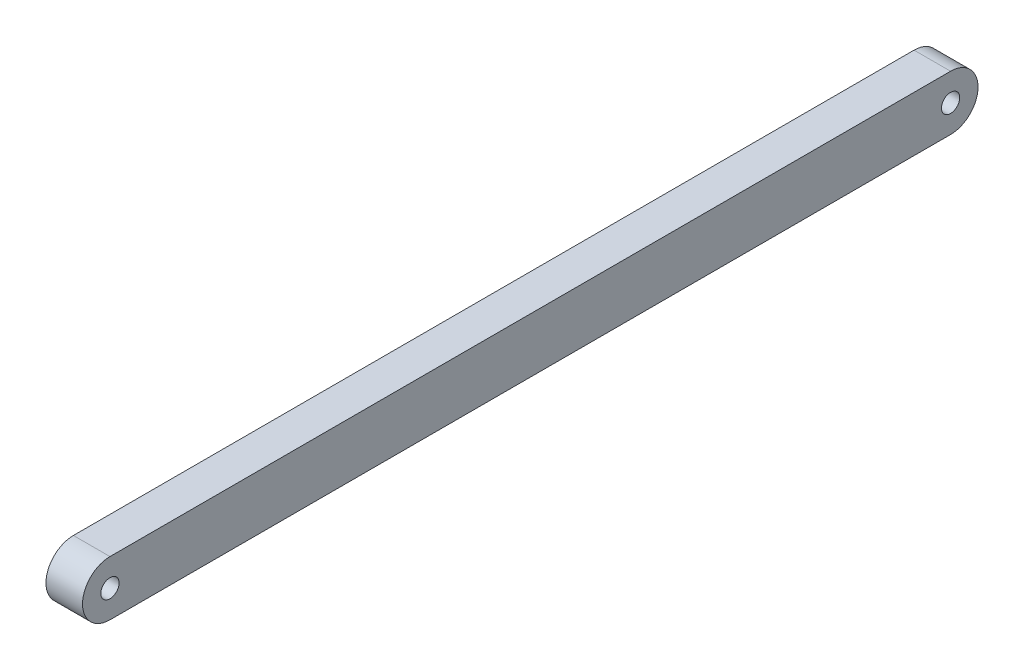
ISO-10303-21;
HEADER;
FILE_DESCRIPTION(('STEP AP214'),'2;1');
FILE_NAME('part.step','',(''),(''),'','','');
FILE_SCHEMA(('AUTOMOTIVE_DESIGN { 1 0 10303 214 1 1 1 1 }'));
ENDSEC;
DATA;
#1=APPLICATION_CONTEXT('core data for automotive mechanical design processes');
#2=APPLICATION_PROTOCOL_DEFINITION('international standard','automotive_design',2000,#1);
#3=PRODUCT_CONTEXT('',#1,'mechanical');
#4=PRODUCT('Part','Part','',(#3));
#5=PRODUCT_RELATED_PRODUCT_CATEGORY('part','',(#4));
#6=PRODUCT_DEFINITION_FORMATION('','',#4);
#7=PRODUCT_DEFINITION_CONTEXT('part definition',#1,'design');
#8=PRODUCT_DEFINITION('design','',#6,#7);
#9=PRODUCT_DEFINITION_SHAPE('','',#8);
#10=(LENGTH_UNIT() NAMED_UNIT(*) SI_UNIT(.MILLI.,.METRE.));
#11=(NAMED_UNIT(*) PLANE_ANGLE_UNIT() SI_UNIT($,.RADIAN.));
#12=(NAMED_UNIT(*) SI_UNIT($,.STERADIAN.) SOLID_ANGLE_UNIT());
#13=UNCERTAINTY_MEASURE_WITH_UNIT(LENGTH_MEASURE(1.E-05),#10,'distance_accuracy_value','');
#14=(GEOMETRIC_REPRESENTATION_CONTEXT(3) GLOBAL_UNCERTAINTY_ASSIGNED_CONTEXT((#13)) GLOBAL_UNIT_ASSIGNED_CONTEXT((#10,
#11,#12)) REPRESENTATION_CONTEXT('',''));
#15=CARTESIAN_POINT('',(0.,0.,0.));
#16=DIRECTION('',(0.,0.,1.));
#17=DIRECTION('',(1.,0.,0.));
#18=AXIS2_PLACEMENT_3D('',#15,#16,#17);
#19=CARTESIAN_POINT('',(2.,0.,0.));
#20=DIRECTION('',(1.,0.,0.));
#21=DIRECTION('',(0.,0.,-1.));
#22=AXIS2_PLACEMENT_3D('',#19,#20,#21);
#23=PLANE('',#22);
#24=CARTESIAN_POINT('',(2.,0.,0.));
#25=DIRECTION('',(1.,0.,0.));
#26=DIRECTION('',(0.,0.,-1.));
#27=AXIS2_PLACEMENT_3D('',#24,#25,#26);
#28=CIRCLE('',#27,0.5);
#29=CARTESIAN_POINT('',(2.,0.,-0.5));
#30=VERTEX_POINT('',#29);
#31=EDGE_CURVE('E108',#30,#30,#28,.T.);
#32=ORIENTED_EDGE('',*,*,#31,.F.);
#33=EDGE_LOOP('',(#32));
#34=FACE_BOUND('',#33,.T.);
#35=CARTESIAN_POINT('',(2.,0.,0.));
#36=DIRECTION('',(1.,0.,0.));
#37=DIRECTION('',(0.,0.,-1.));
#38=AXIS2_PLACEMENT_3D('',#35,#36,#37);
#39=CIRCLE('',#38,1.5);
#40=CARTESIAN_POINT('',(2.,1.5,0.));
#41=VERTEX_POINT('',#40);
#42=CARTESIAN_POINT('',(2.,-1.5,0.));
#43=VERTEX_POINT('',#42);
#44=EDGE_CURVE('E93',#41,#43,#39,.T.);
#45=ORIENTED_EDGE('',*,*,#44,.T.);
#46=DIRECTION('',(0.,0.,-1.));
#47=VECTOR('',#46,1.);
#48=CARTESIAN_POINT('',(2.,-1.5,0.));
#49=LINE('',#48,#47);
#50=CARTESIAN_POINT('',(2.,-1.5,-46.));
#51=VERTEX_POINT('',#50);
#52=EDGE_CURVE('E88',#43,#51,#49,.T.);
#53=ORIENTED_EDGE('',*,*,#52,.T.);
#54=CARTESIAN_POINT('',(2.,0.,-46.));
#55=DIRECTION('',(1.,0.,0.));
#56=DIRECTION('',(0.,0.,-1.));
#57=AXIS2_PLACEMENT_3D('',#54,#55,#56);
#58=CIRCLE('',#57,1.5);
#59=CARTESIAN_POINT('',(2.,1.5,-46.));
#60=VERTEX_POINT('',#59);
#61=EDGE_CURVE('E91',#51,#60,#58,.T.);
#62=ORIENTED_EDGE('',*,*,#61,.T.);
#63=DIRECTION('',(0.,0.,1.));
#64=VECTOR('',#63,1.);
#65=CARTESIAN_POINT('',(2.,1.5,0.));
#66=LINE('',#65,#64);
#67=EDGE_CURVE('E58',#60,#41,#66,.T.);
#68=ORIENTED_EDGE('',*,*,#67,.T.);
#69=EDGE_LOOP('',(#45,#53,#62,#68));
#70=FACE_BOUND('',#69,.T.);
#71=CARTESIAN_POINT('',(2.,0.,-46.));
#72=DIRECTION('',(1.,0.,0.));
#73=DIRECTION('',(0.,0.,-1.));
#74=AXIS2_PLACEMENT_3D('',#71,#72,#73);
#75=CIRCLE('',#74,0.499999999999999);
#76=CARTESIAN_POINT('',(2.,0.,-46.5));
#77=VERTEX_POINT('',#76);
#78=EDGE_CURVE('E123',#77,#77,#75,.T.);
#79=ORIENTED_EDGE('',*,*,#78,.F.);
#80=EDGE_LOOP('',(#79));
#81=FACE_BOUND('',#80,.T.);
#82=ADVANCED_FACE('F41',(#34,#70,#81),#23,.T.);
#83=CARTESIAN_POINT('',(0.,0.,0.));
#84=DIRECTION('',(1.,0.,0.));
#85=DIRECTION('',(0.,0.,-1.));
#86=AXIS2_PLACEMENT_3D('',#83,#84,#85);
#87=PLANE('',#86);
#88=CARTESIAN_POINT('',(0.,0.,0.));
#89=DIRECTION('',(1.,0.,0.));
#90=DIRECTION('',(0.,0.,-1.));
#91=AXIS2_PLACEMENT_3D('',#88,#89,#90);
#92=CIRCLE('',#91,1.5);
#93=CARTESIAN_POINT('',(0.,1.5,0.));
#94=VERTEX_POINT('',#93);
#95=CARTESIAN_POINT('',(0.,-1.5,0.));
#96=VERTEX_POINT('',#95);
#97=EDGE_CURVE('E105',#94,#96,#92,.T.);
#98=ORIENTED_EDGE('',*,*,#97,.F.);
#99=DIRECTION('',(0.,0.,1.));
#100=VECTOR('',#99,1.);
#101=CARTESIAN_POINT('',(0.,1.5,0.));
#102=LINE('',#101,#100);
#103=CARTESIAN_POINT('',(0.,1.5,-46.));
#104=VERTEX_POINT('',#103);
#105=EDGE_CURVE('E81',#104,#94,#102,.T.);
#106=ORIENTED_EDGE('',*,*,#105,.F.);
#107=CARTESIAN_POINT('',(0.,0.,-46.));
#108=DIRECTION('',(1.,0.,0.));
#109=DIRECTION('',(0.,0.,-1.));
#110=AXIS2_PLACEMENT_3D('',#107,#108,#109);
#111=CIRCLE('',#110,1.5);
#112=CARTESIAN_POINT('',(0.,-1.5,-46.));
#113=VERTEX_POINT('',#112);
#114=EDGE_CURVE('E75',#113,#104,#111,.T.);
#115=ORIENTED_EDGE('',*,*,#114,.F.);
#116=DIRECTION('',(0.,0.,-1.));
#117=VECTOR('',#116,1.);
#118=CARTESIAN_POINT('',(0.,-1.5,0.));
#119=LINE('',#118,#117);
#120=EDGE_CURVE('E97',#96,#113,#119,.T.);
#121=ORIENTED_EDGE('',*,*,#120,.F.);
#122=EDGE_LOOP('',(#98,#106,#115,#121));
#123=FACE_BOUND('',#122,.T.);
#124=CARTESIAN_POINT('',(0.,0.,0.));
#125=DIRECTION('',(1.,0.,0.));
#126=DIRECTION('',(0.,0.,-1.));
#127=AXIS2_PLACEMENT_3D('',#124,#125,#126);
#128=CIRCLE('',#127,0.5);
#129=CARTESIAN_POINT('',(0.,0.,-0.5));
#130=VERTEX_POINT('',#129);
#131=EDGE_CURVE('E120',#130,#130,#128,.T.);
#132=ORIENTED_EDGE('',*,*,#131,.T.);
#133=EDGE_LOOP('',(#132));
#134=FACE_BOUND('',#133,.T.);
#135=CARTESIAN_POINT('',(0.,0.,-46.));
#136=DIRECTION('',(1.,0.,0.));
#137=DIRECTION('',(0.,0.,-1.));
#138=AXIS2_PLACEMENT_3D('',#135,#136,#137);
#139=CIRCLE('',#138,0.499999999999999);
#140=CARTESIAN_POINT('',(0.,0.,-46.5));
#141=VERTEX_POINT('',#140);
#142=EDGE_CURVE('E126',#141,#141,#139,.T.);
#143=ORIENTED_EDGE('',*,*,#142,.T.);
#144=EDGE_LOOP('',(#143));
#145=FACE_BOUND('',#144,.T.);
#146=ADVANCED_FACE('F116',(#123,#134,#145),#87,.F.);
#147=CARTESIAN_POINT('',(2.,0.,0.));
#148=DIRECTION('',(-1.,0.,0.));
#149=DIRECTION('',(0.,0.,1.));
#150=AXIS2_PLACEMENT_3D('',#147,#148,#149);
#151=CYLINDRICAL_SURFACE('',#150,1.5);
#152=ORIENTED_EDGE('',*,*,#97,.T.);
#153=DIRECTION('',(-1.,0.,0.));
#154=VECTOR('',#153,1.);
#155=CARTESIAN_POINT('',(2.,-1.5,0.));
#156=LINE('',#155,#154);
#157=EDGE_CURVE('E11',#43,#96,#156,.T.);
#158=ORIENTED_EDGE('',*,*,#157,.F.);
#159=ORIENTED_EDGE('',*,*,#44,.F.);
#160=DIRECTION('',(-1.,0.,0.));
#161=VECTOR('',#160,1.);
#162=CARTESIAN_POINT('',(2.,1.5,0.));
#163=LINE('',#162,#161);
#164=EDGE_CURVE('E101',#41,#94,#163,.T.);
#165=ORIENTED_EDGE('',*,*,#164,.T.);
#166=EDGE_LOOP('',(#152,#158,#159,#165));
#167=FACE_BOUND('',#166,.T.);
#168=ADVANCED_FACE('F43',(#167),#151,.T.);
#169=CARTESIAN_POINT('',(2.,-1.5,0.));
#170=DIRECTION('',(0.,1.,0.));
#171=DIRECTION('',(0.,0.,1.));
#172=AXIS2_PLACEMENT_3D('',#169,#170,#171);
#173=PLANE('',#172);
#174=ORIENTED_EDGE('',*,*,#120,.T.);
#175=DIRECTION('',(-1.,0.,0.));
#176=VECTOR('',#175,1.);
#177=CARTESIAN_POINT('',(2.,-1.5,-46.));
#178=LINE('',#177,#176);
#179=EDGE_CURVE('E50',#51,#113,#178,.T.);
#180=ORIENTED_EDGE('',*,*,#179,.F.);
#181=ORIENTED_EDGE('',*,*,#52,.F.);
#182=ORIENTED_EDGE('',*,*,#157,.T.);
#183=EDGE_LOOP('',(#174,#180,#181,#182));
#184=FACE_BOUND('',#183,.T.);
#185=ADVANCED_FACE('F96',(#184),#173,.F.);
#186=CARTESIAN_POINT('',(2.,0.,-46.));
#187=DIRECTION('',(-1.,0.,0.));
#188=DIRECTION('',(0.,0.,1.));
#189=AXIS2_PLACEMENT_3D('',#186,#187,#188);
#190=CYLINDRICAL_SURFACE('',#189,1.5);
#191=ORIENTED_EDGE('',*,*,#114,.T.);
#192=DIRECTION('',(-1.,0.,0.));
#193=VECTOR('',#192,1.);
#194=CARTESIAN_POINT('',(2.,1.5,-46.));
#195=LINE('',#194,#193);
#196=EDGE_CURVE('E98',#60,#104,#195,.T.);
#197=ORIENTED_EDGE('',*,*,#196,.F.);
#198=ORIENTED_EDGE('',*,*,#61,.F.);
#199=ORIENTED_EDGE('',*,*,#179,.T.);
#200=EDGE_LOOP('',(#191,#197,#198,#199));
#201=FACE_BOUND('',#200,.T.);
#202=ADVANCED_FACE('F99',(#201),#190,.T.);
#203=CARTESIAN_POINT('',(2.,1.5,0.));
#204=DIRECTION('',(0.,-1.,0.));
#205=DIRECTION('',(0.,0.,-1.));
#206=AXIS2_PLACEMENT_3D('',#203,#204,#205);
#207=PLANE('',#206);
#208=ORIENTED_EDGE('',*,*,#105,.T.);
#209=ORIENTED_EDGE('',*,*,#164,.F.);
#210=ORIENTED_EDGE('',*,*,#67,.F.);
#211=ORIENTED_EDGE('',*,*,#196,.T.);
#212=EDGE_LOOP('',(#208,#209,#210,#211));
#213=FACE_BOUND('',#212,.T.);
#214=ADVANCED_FACE('F113',(#213),#207,.F.);
#215=CARTESIAN_POINT('',(2.,0.,0.));
#216=DIRECTION('',(-1.,0.,0.));
#217=DIRECTION('',(0.,0.,1.));
#218=AXIS2_PLACEMENT_3D('',#215,#216,#217);
#219=CYLINDRICAL_SURFACE('',#218,0.5);
#220=ORIENTED_EDGE('',*,*,#31,.T.);
#221=EDGE_LOOP('',(#220));
#222=FACE_BOUND('',#221,.T.);
#223=ORIENTED_EDGE('',*,*,#131,.F.);
#224=EDGE_LOOP('',(#223));
#225=FACE_BOUND('',#224,.T.);
#226=ADVANCED_FACE('F144',(#222,#225),#219,.F.);
#227=CARTESIAN_POINT('',(2.,0.,-46.));
#228=DIRECTION('',(-1.,0.,0.));
#229=DIRECTION('',(0.,0.,1.));
#230=AXIS2_PLACEMENT_3D('',#227,#228,#229);
#231=CYLINDRICAL_SURFACE('',#230,0.499999999999999);
#232=ORIENTED_EDGE('',*,*,#78,.T.);
#233=EDGE_LOOP('',(#232));
#234=FACE_BOUND('',#233,.T.);
#235=ORIENTED_EDGE('',*,*,#142,.F.);
#236=EDGE_LOOP('',(#235));
#237=FACE_BOUND('',#236,.T.);
#238=ADVANCED_FACE('F132',(#234,#237),#231,.F.);
#239=CLOSED_SHELL('',(#82,#146,#168,#185,#202,#214,#226,#238));
#240=MANIFOLD_SOLID_BREP('B2',#239);
#241=ADVANCED_BREP_SHAPE_REPRESENTATION('',(#18,#240),#14);
#242=SHAPE_DEFINITION_REPRESENTATION(#9,#241);
ENDSEC;
END-ISO-10303-21;
